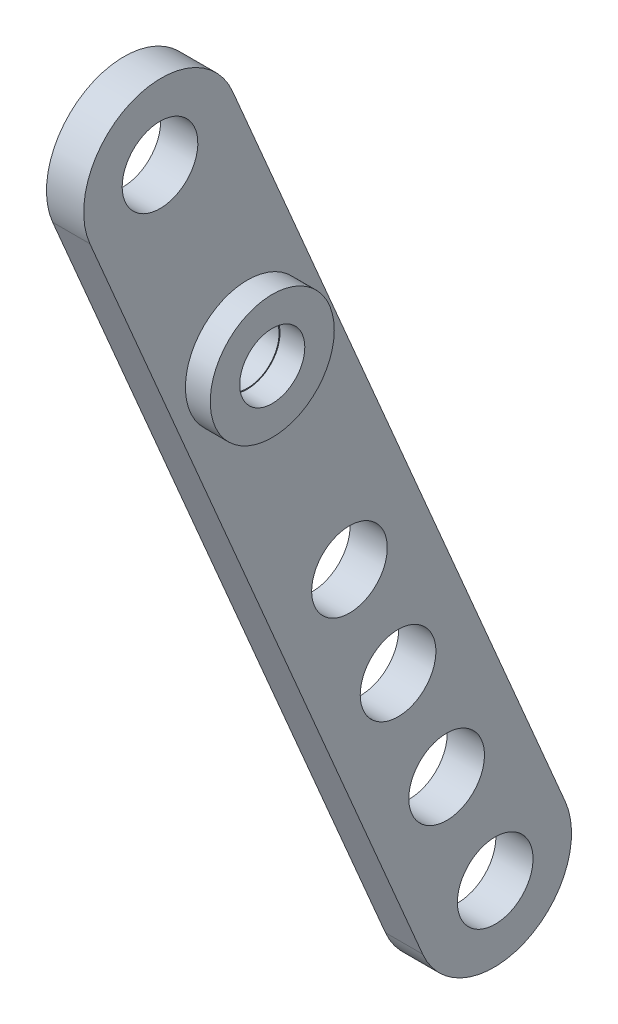
ISO-10303-21;
HEADER;
FILE_DESCRIPTION(('STEP AP214'),'2;1');
FILE_NAME('part.step','',(''),(''),'','','');
FILE_SCHEMA(('AUTOMOTIVE_DESIGN { 1 0 10303 214 1 1 1 1 }'));
ENDSEC;
DATA;
#1=APPLICATION_CONTEXT('core data for automotive mechanical design processes');
#2=APPLICATION_PROTOCOL_DEFINITION('international standard','automotive_design',2000,#1);
#3=PRODUCT_CONTEXT('',#1,'mechanical');
#4=PRODUCT('Part','Part','',(#3));
#5=PRODUCT_RELATED_PRODUCT_CATEGORY('part','',(#4));
#6=PRODUCT_DEFINITION_FORMATION('','',#4);
#7=PRODUCT_DEFINITION_CONTEXT('part definition',#1,'design');
#8=PRODUCT_DEFINITION('design','',#6,#7);
#9=PRODUCT_DEFINITION_SHAPE('','',#8);
#10=(LENGTH_UNIT() NAMED_UNIT(*) SI_UNIT(.MILLI.,.METRE.));
#11=(NAMED_UNIT(*) PLANE_ANGLE_UNIT() SI_UNIT($,.RADIAN.));
#12=(NAMED_UNIT(*) SI_UNIT($,.STERADIAN.) SOLID_ANGLE_UNIT());
#13=UNCERTAINTY_MEASURE_WITH_UNIT(LENGTH_MEASURE(1.E-05),#10,'distance_accuracy_value','');
#14=(GEOMETRIC_REPRESENTATION_CONTEXT(3) GLOBAL_UNCERTAINTY_ASSIGNED_CONTEXT((#13)) GLOBAL_UNIT_ASSIGNED_CONTEXT((#10,
#11,#12)) REPRESENTATION_CONTEXT('',''));
#15=CARTESIAN_POINT('',(0.,0.,0.));
#16=DIRECTION('',(0.,0.,1.));
#17=DIRECTION('',(1.,0.,0.));
#18=AXIS2_PLACEMENT_3D('',#15,#16,#17);
#19=CARTESIAN_POINT('',(12.5,25.9263817960788,-40.1354648199628));
#20=DIRECTION('',(-1.,0.,0.));
#21=DIRECTION('',(0.,1.,0.));
#22=AXIS2_PLACEMENT_3D('',#19,#20,#21);
#23=PLANE('',#22);
#24=CARTESIAN_POINT('',(12.5,25.9263817960788,-40.1354648199628));
#25=DIRECTION('',(1.,0.,0.));
#26=DIRECTION('',(0.,0.,1.));
#27=AXIS2_PLACEMENT_3D('',#24,#25,#26);
#28=CIRCLE('',#27,5.25);
#29=CARTESIAN_POINT('',(12.5,25.9263817960788,-34.8854648199628));
#30=VERTEX_POINT('',#29);
#31=EDGE_CURVE('E11',#30,#30,#28,.T.);
#32=ORIENTED_EDGE('',*,*,#31,.T.);
#33=EDGE_LOOP('',(#32));
#34=FACE_BOUND('',#33,.T.);
#35=CARTESIAN_POINT('',(12.5,25.9263817960788,-40.1354648199628));
#36=DIRECTION('',(-1.,0.,0.));
#37=DIRECTION('',(0.,0.,1.));
#38=AXIS2_PLACEMENT_3D('',#35,#36,#37);
#39=CIRCLE('',#38,10.);
#40=CARTESIAN_POINT('',(12.5,25.9263817960788,-30.1354648199628));
#41=VERTEX_POINT('',#40);
#42=EDGE_CURVE('E21',#41,#41,#39,.T.);
#43=ORIENTED_EDGE('',*,*,#42,.T.);
#44=EDGE_LOOP('',(#43));
#45=FACE_BOUND('',#44,.T.);
#46=ADVANCED_FACE('F17',(#34,#45),#23,.T.);
#47=CARTESIAN_POINT('',(14.5,25.9263817960788,-40.1354648199628));
#48=DIRECTION('',(-1.,0.,0.));
#49=DIRECTION('',(0.,0.,1.));
#50=AXIS2_PLACEMENT_3D('',#47,#48,#49);
#51=CYLINDRICAL_SURFACE('',#50,5.25);
#52=CARTESIAN_POINT('',(14.5,25.9263817960788,-40.1354648199628));
#53=DIRECTION('',(1.,0.,0.));
#54=DIRECTION('',(0.,0.,1.));
#55=AXIS2_PLACEMENT_3D('',#52,#53,#54);
#56=CIRCLE('',#55,5.25);
#57=CARTESIAN_POINT('',(14.5,25.9263817960788,-34.8854648199628));
#58=VERTEX_POINT('',#57);
#59=EDGE_CURVE('E241',#58,#58,#56,.T.);
#60=ORIENTED_EDGE('',*,*,#59,.T.);
#61=EDGE_LOOP('',(#60));
#62=FACE_BOUND('',#61,.T.);
#63=ORIENTED_EDGE('',*,*,#31,.F.);
#64=EDGE_LOOP('',(#63));
#65=FACE_BOUND('',#64,.T.);
#66=ADVANCED_FACE('F19',(#62,#65),#51,.F.);
#67=CARTESIAN_POINT('',(14.5,25.9263817960788,-40.1354648199628));
#68=DIRECTION('',(-1.,0.,0.));
#69=DIRECTION('',(0.,0.,1.));
#70=AXIS2_PLACEMENT_3D('',#67,#68,#69);
#71=CYLINDRICAL_SURFACE('',#70,10.);
#72=CARTESIAN_POINT('',(14.5,25.9263817960788,-40.1354648199628));
#73=DIRECTION('',(-1.,0.,0.));
#74=DIRECTION('',(0.,0.,1.));
#75=AXIS2_PLACEMENT_3D('',#72,#73,#74);
#76=CIRCLE('',#75,10.);
#77=CARTESIAN_POINT('',(14.5,25.9263817960788,-30.1354648199628));
#78=VERTEX_POINT('',#77);
#79=EDGE_CURVE('E239',#78,#78,#76,.T.);
#80=ORIENTED_EDGE('',*,*,#79,.T.);
#81=EDGE_LOOP('',(#80));
#82=FACE_BOUND('',#81,.T.);
#83=ORIENTED_EDGE('',*,*,#42,.F.);
#84=EDGE_LOOP('',(#83));
#85=FACE_BOUND('',#84,.T.);
#86=ADVANCED_FACE('F388',(#82,#85),#71,.T.);
#87=CARTESIAN_POINT('',(14.5,22.5201189785171,-0.434989200758586));
#88=DIRECTION('',(1.,0.,0.));
#89=DIRECTION('',(0.,0.,-1.));
#90=AXIS2_PLACEMENT_3D('',#87,#88,#89);
#91=PLANE('',#90);
#92=CARTESIAN_POINT('',(14.5,25.9263817960858,-40.1354648199622));
#93=DIRECTION('',(1.,0.,0.));
#94=DIRECTION('',(0.,-0.920081490833036,-0.391727009825028));
#95=AXIS2_PLACEMENT_3D('',#92,#93,#94);
#96=CIRCLE('',#95,5.1);
#97=CARTESIAN_POINT('',(14.5,21.2339661928374,-42.1332725700699));
#98=VERTEX_POINT('',#97);
#99=EDGE_CURVE('E236',#98,#98,#96,.T.);
#100=ORIENTED_EDGE('',*,*,#99,.T.);
#101=EDGE_LOOP('',(#100));
#102=FACE_BOUND('',#101,.T.);
#103=ORIENTED_EDGE('',*,*,#59,.F.);
#104=EDGE_LOOP('',(#103));
#105=FACE_BOUND('',#104,.T.);
#106=ADVANCED_FACE('F267',(#102,#105),#91,.F.);
#107=CARTESIAN_POINT('',(14.5,22.5201189785171,-0.434989200758586));
#108=DIRECTION('',(1.,0.,0.));
#109=DIRECTION('',(0.,0.,-1.));
#110=AXIS2_PLACEMENT_3D('',#107,#108,#109);
#111=PLANE('',#110);
#112=CARTESIAN_POINT('',(14.5,-12.7170408189017,-56.5879992326134));
#113=DIRECTION('',(1.,0.,0.));
#114=DIRECTION('',(0.,-0.920081490833036,-0.391727009825028));
#115=AXIS2_PLACEMENT_3D('',#112,#113,#114);
#116=CIRCLE('',#115,6.1);
#117=CARTESIAN_POINT('',(14.5,-18.3295379129832,-58.9775339925461));
#118=VERTEX_POINT('',#117);
#119=EDGE_CURVE('E233',#118,#118,#116,.T.);
#120=ORIENTED_EDGE('',*,*,#119,.T.);
#121=EDGE_LOOP('',(#120));
#122=FACE_BOUND('',#121,.T.);
#123=CARTESIAN_POINT('',(14.5,59.0493154660752,-26.0332924662612));
#124=DIRECTION('',(1.,0.,0.));
#125=DIRECTION('',(0.,-0.920081490833036,-0.391727009825028));
#126=AXIS2_PLACEMENT_3D('',#123,#124,#125);
#127=CIRCLE('',#126,6.1);
#128=CARTESIAN_POINT('',(14.5,53.4368183719936,-28.4228272261939));
#129=VERTEX_POINT('',#128);
#130=EDGE_CURVE('E189',#129,#129,#127,.T.);
#131=ORIENTED_EDGE('',*,*,#130,.T.);
#132=EDGE_LOOP('',(#131));
#133=FACE_BOUND('',#132,.T.);
#134=CARTESIAN_POINT('',(14.5,-67.9219302688839,-80.0916198221151));
#135=DIRECTION('',(1.,0.,0.));
#136=DIRECTION('',(0.,-0.920081490833036,-0.391727009825028));
#137=AXIS2_PLACEMENT_3D('',#134,#135,#136);
#138=CIRCLE('',#137,6.1);
#139=CARTESIAN_POINT('',(14.5,-73.5344273629654,-82.4811545820478));
#140=VERTEX_POINT('',#139);
#141=EDGE_CURVE('E186',#140,#140,#138,.T.);
#142=ORIENTED_EDGE('',*,*,#141,.T.);
#143=EDGE_LOOP('',(#142));
#144=FACE_BOUND('',#143,.T.);
#145=CARTESIAN_POINT('',(14.5,-31.1186706355624,-64.422539429114));
#146=DIRECTION('',(1.,0.,0.));
#147=DIRECTION('',(0.,-0.920081490833036,-0.391727009825028));
#148=AXIS2_PLACEMENT_3D('',#145,#146,#147);
#149=CIRCLE('',#148,6.1);
#150=CARTESIAN_POINT('',(14.5,-36.7311677296439,-66.8120741890466));
#151=VERTEX_POINT('',#150);
#152=EDGE_CURVE('E190',#151,#151,#149,.T.);
#153=ORIENTED_EDGE('',*,*,#152,.T.);
#154=EDGE_LOOP('',(#153));
#155=FACE_BOUND('',#154,.T.);
#156=CARTESIAN_POINT('',(14.5,-49.5203004522231,-72.2570796256145));
#157=DIRECTION('',(1.,0.,0.));
#158=DIRECTION('',(0.,-0.920081490833036,-0.391727009825028));
#159=AXIS2_PLACEMENT_3D('',#156,#157,#158);
#160=CIRCLE('',#159,6.1);
#161=CARTESIAN_POINT('',(14.5,-55.1327975463046,-74.6466143855472));
#162=VERTEX_POINT('',#161);
#163=EDGE_CURVE('E226',#162,#162,#160,.T.);
#164=ORIENTED_EDGE('',*,*,#163,.T.);
#165=EDGE_LOOP('',(#164));
#166=FACE_BOUND('',#165,.T.);
#167=ORIENTED_EDGE('',*,*,#79,.F.);
#168=EDGE_LOOP('',(#167));
#169=FACE_BOUND('',#168,.T.);
#170=CARTESIAN_POINT('',(14.5,-67.4618895234673,-79.8957563172026));
#171=DIRECTION('',(1.,0.,0.));
#172=DIRECTION('',(0.,-0.391727009825028,0.920081490833036));
#173=AXIS2_PLACEMENT_3D('',#170,#171,#172);
#174=CIRCLE('',#173,12.5);
#175=CARTESIAN_POINT('',(14.5,-72.3584771462802,-68.3947376817896));
#176=VERTEX_POINT('',#175);
#177=CARTESIAN_POINT('',(14.5,-62.5653019006545,-91.3967749526155));
#178=VERTEX_POINT('',#177);
#179=EDGE_CURVE('E222',#176,#178,#174,.T.);
#180=ORIENTED_EDGE('',*,*,#179,.F.);
#181=DIRECTION('',(0.,-0.920081490833036,-0.391727009825028));
#182=VECTOR('',#181,1.);
#183=CARTESIAN_POINT('',(14.5,53.6926870978458,-14.7281373357608));
#184=LINE('',#183,#182);
#185=CARTESIAN_POINT('',(14.5,53.6926870978458,-14.7281373357608));
#186=VERTEX_POINT('',#185);
#187=EDGE_CURVE('E216',#186,#176,#184,.T.);
#188=ORIENTED_EDGE('',*,*,#187,.F.);
#189=CARTESIAN_POINT('',(14.5,58.5892747206586,-26.2291559711737));
#190=DIRECTION('',(1.,0.,0.));
#191=DIRECTION('',(0.,0.391727009825028,-0.920081490833036));
#192=AXIS2_PLACEMENT_3D('',#189,#190,#191);
#193=CIRCLE('',#192,12.5);
#194=CARTESIAN_POINT('',(14.5,63.4858623434715,-37.7301746065867));
#195=VERTEX_POINT('',#194);
#196=EDGE_CURVE('E209',#195,#186,#193,.T.);
#197=ORIENTED_EDGE('',*,*,#196,.F.);
#198=DIRECTION('',(0.,0.920081490833036,0.391727009825028));
#199=VECTOR('',#198,1.);
#200=CARTESIAN_POINT('',(14.5,-62.5653019006545,-91.3967749526155));
#201=LINE('',#200,#199);
#202=EDGE_CURVE('E153',#178,#195,#201,.T.);
#203=ORIENTED_EDGE('',*,*,#202,.F.);
#204=EDGE_LOOP('',(#180,#188,#197,#203));
#205=FACE_BOUND('',#204,.T.);
#206=ADVANCED_FACE('F262',(#122,#133,#144,#155,#166,#169,#205),#111,.F.);
#207=CARTESIAN_POINT('',(14.5,25.9263817960858,-40.1354648199622));
#208=DIRECTION('',(1.,0.,0.));
#209=DIRECTION('',(0.,-0.920081490833036,-0.391727009825028));
#210=AXIS2_PLACEMENT_3D('',#207,#208,#209);
#211=CYLINDRICAL_SURFACE('',#210,5.1);
#212=CARTESIAN_POINT('',(20.5,25.9263817960858,-40.1354648199622));
#213=DIRECTION('',(-1.,0.,0.));
#214=DIRECTION('',(0.,-0.920081490833036,-0.391727009825028));
#215=AXIS2_PLACEMENT_3D('',#212,#213,#214);
#216=CIRCLE('',#215,5.1);
#217=CARTESIAN_POINT('',(20.5,21.2339661928374,-42.1332725700699));
#218=VERTEX_POINT('',#217);
#219=EDGE_CURVE('E148',#218,#218,#216,.T.);
#220=ORIENTED_EDGE('',*,*,#219,.F.);
#221=EDGE_LOOP('',(#220));
#222=FACE_BOUND('',#221,.T.);
#223=ORIENTED_EDGE('',*,*,#99,.F.);
#224=EDGE_LOOP('',(#223));
#225=FACE_BOUND('',#224,.T.);
#226=ADVANCED_FACE('F266',(#222,#225),#211,.F.);
#227=CARTESIAN_POINT('',(14.5,-12.7170408189017,-56.5879992326134));
#228=DIRECTION('',(1.,0.,0.));
#229=DIRECTION('',(0.,-0.920081490833036,-0.391727009825028));
#230=AXIS2_PLACEMENT_3D('',#227,#228,#229);
#231=CYLINDRICAL_SURFACE('',#230,6.1);
#232=CARTESIAN_POINT('',(20.5,-12.7170408189017,-56.5879992326134));
#233=DIRECTION('',(-1.,0.,0.));
#234=DIRECTION('',(0.,-0.920081490833036,-0.391727009825028));
#235=AXIS2_PLACEMENT_3D('',#232,#233,#234);
#236=CIRCLE('',#235,6.1);
#237=CARTESIAN_POINT('',(20.5,-18.3295379129832,-58.9775339925461));
#238=VERTEX_POINT('',#237);
#239=EDGE_CURVE('E154',#238,#238,#236,.T.);
#240=ORIENTED_EDGE('',*,*,#239,.F.);
#241=EDGE_LOOP('',(#240));
#242=FACE_BOUND('',#241,.T.);
#243=ORIENTED_EDGE('',*,*,#119,.F.);
#244=EDGE_LOOP('',(#243));
#245=FACE_BOUND('',#244,.T.);
#246=ADVANCED_FACE('F367',(#242,#245),#231,.F.);
#247=CARTESIAN_POINT('',(14.5,59.0493154660752,-26.0332924662612));
#248=DIRECTION('',(1.,0.,0.));
#249=DIRECTION('',(0.,-0.920081490833036,-0.391727009825028));
#250=AXIS2_PLACEMENT_3D('',#247,#248,#249);
#251=CYLINDRICAL_SURFACE('',#250,6.1);
#252=CARTESIAN_POINT('',(20.5,59.0493154660752,-26.0332924662612));
#253=DIRECTION('',(-1.,0.,0.));
#254=DIRECTION('',(0.,-0.920081490833036,-0.391727009825028));
#255=AXIS2_PLACEMENT_3D('',#252,#253,#254);
#256=CIRCLE('',#255,6.1);
#257=CARTESIAN_POINT('',(20.5,53.4368183719936,-28.4228272261939));
#258=VERTEX_POINT('',#257);
#259=EDGE_CURVE('E164',#258,#258,#256,.T.);
#260=ORIENTED_EDGE('',*,*,#259,.F.);
#261=EDGE_LOOP('',(#260));
#262=FACE_BOUND('',#261,.T.);
#263=ORIENTED_EDGE('',*,*,#130,.F.);
#264=EDGE_LOOP('',(#263));
#265=FACE_BOUND('',#264,.T.);
#266=ADVANCED_FACE('F277',(#262,#265),#251,.F.);
#267=CARTESIAN_POINT('',(14.5,-67.9219302688839,-80.0916198221151));
#268=DIRECTION('',(1.,0.,0.));
#269=DIRECTION('',(0.,-0.920081490833036,-0.391727009825028));
#270=AXIS2_PLACEMENT_3D('',#267,#268,#269);
#271=CYLINDRICAL_SURFACE('',#270,6.1);
#272=CARTESIAN_POINT('',(20.5,-67.9219302688839,-80.0916198221151));
#273=DIRECTION('',(-1.,0.,0.));
#274=DIRECTION('',(0.,-0.920081490833036,-0.391727009825028));
#275=AXIS2_PLACEMENT_3D('',#272,#273,#274);
#276=CIRCLE('',#275,6.1);
#277=CARTESIAN_POINT('',(20.5,-73.5344273629654,-82.4811545820478));
#278=VERTEX_POINT('',#277);
#279=EDGE_CURVE('E191',#278,#278,#276,.T.);
#280=ORIENTED_EDGE('',*,*,#279,.F.);
#281=EDGE_LOOP('',(#280));
#282=FACE_BOUND('',#281,.T.);
#283=ORIENTED_EDGE('',*,*,#141,.F.);
#284=EDGE_LOOP('',(#283));
#285=FACE_BOUND('',#284,.T.);
#286=ADVANCED_FACE('F272',(#282,#285),#271,.F.);
#287=CARTESIAN_POINT('',(14.5,-31.1186706355624,-64.422539429114));
#288=DIRECTION('',(1.,0.,0.));
#289=DIRECTION('',(0.,-0.920081490833036,-0.391727009825028));
#290=AXIS2_PLACEMENT_3D('',#287,#288,#289);
#291=CYLINDRICAL_SURFACE('',#290,6.1);
#292=CARTESIAN_POINT('',(20.5,-31.1186706355624,-64.422539429114));
#293=DIRECTION('',(-1.,0.,0.));
#294=DIRECTION('',(0.,-0.920081490833036,-0.391727009825028));
#295=AXIS2_PLACEMENT_3D('',#292,#293,#294);
#296=CIRCLE('',#295,6.1);
#297=CARTESIAN_POINT('',(20.5,-36.7311677296439,-66.8120741890466));
#298=VERTEX_POINT('',#297);
#299=EDGE_CURVE('E194',#298,#298,#296,.T.);
#300=ORIENTED_EDGE('',*,*,#299,.F.);
#301=EDGE_LOOP('',(#300));
#302=FACE_BOUND('',#301,.T.);
#303=ORIENTED_EDGE('',*,*,#152,.F.);
#304=EDGE_LOOP('',(#303));
#305=FACE_BOUND('',#304,.T.);
#306=ADVANCED_FACE('F276',(#302,#305),#291,.F.);
#307=CARTESIAN_POINT('',(14.5,-49.5203004522231,-72.2570796256145));
#308=DIRECTION('',(1.,0.,0.));
#309=DIRECTION('',(0.,-0.920081490833036,-0.391727009825028));
#310=AXIS2_PLACEMENT_3D('',#307,#308,#309);
#311=CYLINDRICAL_SURFACE('',#310,6.1);
#312=CARTESIAN_POINT('',(20.5,-49.5203004522231,-72.2570796256145));
#313=DIRECTION('',(-1.,0.,0.));
#314=DIRECTION('',(0.,-0.920081490833036,-0.391727009825028));
#315=AXIS2_PLACEMENT_3D('',#312,#313,#314);
#316=CIRCLE('',#315,6.1);
#317=CARTESIAN_POINT('',(20.5,-55.1327975463046,-74.6466143855472));
#318=VERTEX_POINT('',#317);
#319=EDGE_CURVE('E180',#318,#318,#316,.T.);
#320=ORIENTED_EDGE('',*,*,#319,.F.);
#321=EDGE_LOOP('',(#320));
#322=FACE_BOUND('',#321,.T.);
#323=ORIENTED_EDGE('',*,*,#163,.F.);
#324=EDGE_LOOP('',(#323));
#325=FACE_BOUND('',#324,.T.);
#326=ADVANCED_FACE('F337',(#322,#325),#311,.F.);
#327=CARTESIAN_POINT('',(14.5,-67.4618895234673,-79.8957563172026));
#328=DIRECTION('',(1.,0.,0.));
#329=DIRECTION('',(0.,-0.391727009825028,0.920081490833036));
#330=AXIS2_PLACEMENT_3D('',#327,#328,#329);
#331=CYLINDRICAL_SURFACE('',#330,12.5);
#332=ORIENTED_EDGE('',*,*,#179,.T.);
#333=DIRECTION('',(1.,0.,0.));
#334=VECTOR('',#333,1.);
#335=CARTESIAN_POINT('',(14.5,-62.5653019006545,-91.3967749526155));
#336=LINE('',#335,#334);
#337=CARTESIAN_POINT('',(20.5,-62.5653019006545,-91.3967749526155));
#338=VERTEX_POINT('',#337);
#339=EDGE_CURVE('E206',#178,#338,#336,.T.);
#340=ORIENTED_EDGE('',*,*,#339,.T.);
#341=CARTESIAN_POINT('',(20.5,-67.4618895234673,-79.8957563172026));
#342=DIRECTION('',(1.,0.,0.));
#343=DIRECTION('',(0.,-0.391727009825028,0.920081490833036));
#344=AXIS2_PLACEMENT_3D('',#341,#342,#343);
#345=CIRCLE('',#344,12.5);
#346=CARTESIAN_POINT('',(20.5,-72.3584771462802,-68.3947376817896));
#347=VERTEX_POINT('',#346);
#348=EDGE_CURVE('E176',#347,#338,#345,.T.);
#349=ORIENTED_EDGE('',*,*,#348,.F.);
#350=DIRECTION('',(1.,0.,0.));
#351=VECTOR('',#350,1.);
#352=CARTESIAN_POINT('',(14.5,-72.3584771462802,-68.3947376817896));
#353=LINE('',#352,#351);
#354=EDGE_CURVE('E220',#176,#347,#353,.T.);
#355=ORIENTED_EDGE('',*,*,#354,.F.);
#356=EDGE_LOOP('',(#332,#340,#349,#355));
#357=FACE_BOUND('',#356,.T.);
#358=ADVANCED_FACE('F345',(#357),#331,.T.);
#359=CARTESIAN_POINT('',(14.5,53.6926870978458,-14.7281373357608));
#360=DIRECTION('',(0.,-0.391727009825028,0.920081490833036));
#361=DIRECTION('',(-1.,0.,0.));
#362=AXIS2_PLACEMENT_3D('',#359,#360,#361);
#363=PLANE('',#362);
#364=ORIENTED_EDGE('',*,*,#187,.T.);
#365=ORIENTED_EDGE('',*,*,#354,.T.);
#366=DIRECTION('',(0.,-0.920081490833036,-0.391727009825028));
#367=VECTOR('',#366,1.);
#368=CARTESIAN_POINT('',(20.5,53.6926870978458,-14.7281373357608));
#369=LINE('',#368,#367);
#370=CARTESIAN_POINT('',(20.5,53.6926870978458,-14.7281373357608));
#371=VERTEX_POINT('',#370);
#372=EDGE_CURVE('E181',#371,#347,#369,.T.);
#373=ORIENTED_EDGE('',*,*,#372,.F.);
#374=DIRECTION('',(1.,0.,0.));
#375=VECTOR('',#374,1.);
#376=CARTESIAN_POINT('',(14.5,53.6926870978458,-14.7281373357608));
#377=LINE('',#376,#375);
#378=EDGE_CURVE('E213',#186,#371,#377,.T.);
#379=ORIENTED_EDGE('',*,*,#378,.F.);
#380=EDGE_LOOP('',(#364,#365,#373,#379));
#381=FACE_BOUND('',#380,.T.);
#382=ADVANCED_FACE('F329',(#381),#363,.T.);
#383=CARTESIAN_POINT('',(14.5,58.5892747206586,-26.2291559711737));
#384=DIRECTION('',(1.,0.,0.));
#385=DIRECTION('',(0.,0.391727009825028,-0.920081490833036));
#386=AXIS2_PLACEMENT_3D('',#383,#384,#385);
#387=CYLINDRICAL_SURFACE('',#386,12.5);
#388=ORIENTED_EDGE('',*,*,#196,.T.);
#389=ORIENTED_EDGE('',*,*,#378,.T.);
#390=CARTESIAN_POINT('',(20.5,58.5892747206586,-26.2291559711737));
#391=DIRECTION('',(1.,0.,0.));
#392=DIRECTION('',(0.,0.391727009825028,-0.920081490833036));
#393=AXIS2_PLACEMENT_3D('',#390,#391,#392);
#394=CIRCLE('',#393,12.5);
#395=CARTESIAN_POINT('',(20.5,63.4858623434715,-37.7301746065867));
#396=VERTEX_POINT('',#395);
#397=EDGE_CURVE('E185',#396,#371,#394,.T.);
#398=ORIENTED_EDGE('',*,*,#397,.F.);
#399=DIRECTION('',(1.,0.,0.));
#400=VECTOR('',#399,1.);
#401=CARTESIAN_POINT('',(14.5,63.4858623434715,-37.7301746065867));
#402=LINE('',#401,#400);
#403=EDGE_CURVE('E161',#195,#396,#402,.T.);
#404=ORIENTED_EDGE('',*,*,#403,.F.);
#405=EDGE_LOOP('',(#388,#389,#398,#404));
#406=FACE_BOUND('',#405,.T.);
#407=ADVANCED_FACE('F315',(#406),#387,.T.);
#408=CARTESIAN_POINT('',(14.5,-62.5653019006545,-91.3967749526155));
#409=DIRECTION('',(0.,0.391727009825028,-0.920081490833036));
#410=DIRECTION('',(-1.,0.,0.));
#411=AXIS2_PLACEMENT_3D('',#408,#409,#410);
#412=PLANE('',#411);
#413=ORIENTED_EDGE('',*,*,#202,.T.);
#414=ORIENTED_EDGE('',*,*,#403,.T.);
#415=DIRECTION('',(0.,0.920081490833036,0.391727009825028));
#416=VECTOR('',#415,1.);
#417=CARTESIAN_POINT('',(20.5,-62.5653019006545,-91.3967749526155));
#418=LINE('',#417,#416);
#419=EDGE_CURVE('E175',#338,#396,#418,.T.);
#420=ORIENTED_EDGE('',*,*,#419,.F.);
#421=ORIENTED_EDGE('',*,*,#339,.F.);
#422=EDGE_LOOP('',(#413,#414,#420,#421));
#423=FACE_BOUND('',#422,.T.);
#424=ADVANCED_FACE('F308',(#423),#412,.T.);
#425=CARTESIAN_POINT('',(20.5,22.5201189785171,-0.434989200758588));
#426=DIRECTION('',(1.,0.,0.));
#427=DIRECTION('',(0.,0.,-1.));
#428=AXIS2_PLACEMENT_3D('',#425,#426,#427);
#429=PLANE('',#428);
#430=ORIENTED_EDGE('',*,*,#219,.T.);
#431=EDGE_LOOP('',(#430));
#432=FACE_BOUND('',#431,.T.);
#433=CARTESIAN_POINT('',(20.5,25.9263817960788,-40.1354648199628));
#434=DIRECTION('',(-1.,0.,0.));
#435=DIRECTION('',(0.,0.,-1.));
#436=AXIS2_PLACEMENT_3D('',#433,#434,#435);
#437=CIRCLE('',#436,5.25);
#438=CARTESIAN_POINT('',(20.5,25.9263817960788,-45.3854648199628));
#439=VERTEX_POINT('',#438);
#440=EDGE_CURVE('E170',#439,#439,#437,.T.);
#441=ORIENTED_EDGE('',*,*,#440,.F.);
#442=EDGE_LOOP('',(#441));
#443=FACE_BOUND('',#442,.T.);
#444=ADVANCED_FACE('F149',(#432,#443),#429,.T.);
#445=CARTESIAN_POINT('',(24.5,25.9263817960858,-40.1354648199622));
#446=DIRECTION('',(1.,0.,0.));
#447=DIRECTION('',(0.,0.,-1.));
#448=AXIS2_PLACEMENT_3D('',#445,#446,#447);
#449=PLANE('',#448);
#450=CARTESIAN_POINT('',(24.5,25.9263817960858,-40.1354648199622));
#451=DIRECTION('',(-1.,0.,0.));
#452=DIRECTION('',(0.,0.,-1.));
#453=AXIS2_PLACEMENT_3D('',#450,#451,#452);
#454=CIRCLE('',#453,5.25);
#455=CARTESIAN_POINT('',(24.5,25.9263817960858,-45.3854648199622));
#456=VERTEX_POINT('',#455);
#457=EDGE_CURVE('E172',#456,#456,#454,.T.);
#458=ORIENTED_EDGE('',*,*,#457,.T.);
#459=EDGE_LOOP('',(#458));
#460=FACE_BOUND('',#459,.T.);
#461=CARTESIAN_POINT('',(24.5,25.9263817960858,-40.1354648199622));
#462=DIRECTION('',(1.,0.,0.));
#463=DIRECTION('',(0.,0.,-1.));
#464=AXIS2_PLACEMENT_3D('',#461,#462,#463);
#465=CIRCLE('',#464,10.);
#466=CARTESIAN_POINT('',(24.5,25.9263817960858,-50.1354648199622));
#467=VERTEX_POINT('',#466);
#468=EDGE_CURVE('E168',#467,#467,#465,.T.);
#469=ORIENTED_EDGE('',*,*,#468,.T.);
#470=EDGE_LOOP('',(#469));
#471=FACE_BOUND('',#470,.T.);
#472=ADVANCED_FACE('F293',(#460,#471),#449,.T.);
#473=CARTESIAN_POINT('',(20.5,22.5201189785171,-0.434989200758588));
#474=DIRECTION('',(1.,0.,0.));
#475=DIRECTION('',(0.,0.,-1.));
#476=AXIS2_PLACEMENT_3D('',#473,#474,#475);
#477=PLANE('',#476);
#478=ORIENTED_EDGE('',*,*,#239,.T.);
#479=EDGE_LOOP('',(#478));
#480=FACE_BOUND('',#479,.T.);
#481=ORIENTED_EDGE('',*,*,#259,.T.);
#482=EDGE_LOOP('',(#481));
#483=FACE_BOUND('',#482,.T.);
#484=ORIENTED_EDGE('',*,*,#279,.T.);
#485=EDGE_LOOP('',(#484));
#486=FACE_BOUND('',#485,.T.);
#487=ORIENTED_EDGE('',*,*,#299,.T.);
#488=EDGE_LOOP('',(#487));
#489=FACE_BOUND('',#488,.T.);
#490=ORIENTED_EDGE('',*,*,#319,.T.);
#491=EDGE_LOOP('',(#490));
#492=FACE_BOUND('',#491,.T.);
#493=CARTESIAN_POINT('',(20.5,25.9263817960788,-40.1354648199628));
#494=DIRECTION('',(1.,0.,0.));
#495=DIRECTION('',(0.,0.,-1.));
#496=AXIS2_PLACEMENT_3D('',#493,#494,#495);
#497=CIRCLE('',#496,10.);
#498=CARTESIAN_POINT('',(20.5,25.9263817960788,-50.1354648199628));
#499=VERTEX_POINT('',#498);
#500=EDGE_CURVE('E466',#499,#499,#497,.T.);
#501=ORIENTED_EDGE('',*,*,#500,.F.);
#502=EDGE_LOOP('',(#501));
#503=FACE_BOUND('',#502,.T.);
#504=ORIENTED_EDGE('',*,*,#419,.T.);
#505=ORIENTED_EDGE('',*,*,#397,.T.);
#506=ORIENTED_EDGE('',*,*,#372,.T.);
#507=ORIENTED_EDGE('',*,*,#348,.T.);
#508=EDGE_LOOP('',(#504,#505,#506,#507));
#509=FACE_BOUND('',#508,.T.);
#510=ADVANCED_FACE('F285',(#480,#483,#486,#489,#492,#503,#509),#477,.T.);
#511=CARTESIAN_POINT('',(20.5,25.9263817960788,-40.1354648199628));
#512=DIRECTION('',(1.,0.,0.));
#513=DIRECTION('',(0.,0.,-1.));
#514=AXIS2_PLACEMENT_3D('',#511,#512,#513);
#515=CYLINDRICAL_SURFACE('',#514,5.25);
#516=ORIENTED_EDGE('',*,*,#457,.F.);
#517=EDGE_LOOP('',(#516));
#518=FACE_BOUND('',#517,.T.);
#519=ORIENTED_EDGE('',*,*,#440,.T.);
#520=EDGE_LOOP('',(#519));
#521=FACE_BOUND('',#520,.T.);
#522=ADVANCED_FACE('F256',(#518,#521),#515,.F.);
#523=CARTESIAN_POINT('',(20.5,25.9263817960788,-40.1354648199628));
#524=DIRECTION('',(1.,0.,0.));
#525=DIRECTION('',(0.,0.,-1.));
#526=AXIS2_PLACEMENT_3D('',#523,#524,#525);
#527=CYLINDRICAL_SURFACE('',#526,10.);
#528=ORIENTED_EDGE('',*,*,#468,.F.);
#529=EDGE_LOOP('',(#528));
#530=FACE_BOUND('',#529,.T.);
#531=ORIENTED_EDGE('',*,*,#500,.T.);
#532=EDGE_LOOP('',(#531));
#533=FACE_BOUND('',#532,.T.);
#534=ADVANCED_FACE('F251',(#530,#533),#527,.T.);
#535=CLOSED_SHELL('',(#46,#66,#86,#106,#206,#226,#246,#266,#286,#306,#326,#358,#382,#407,#424,
#444,#472,#510,#522,#534));
#536=MANIFOLD_SOLID_BREP('B1',#535);
#537=ADVANCED_BREP_SHAPE_REPRESENTATION('',(#18,#536),#14);
#538=SHAPE_DEFINITION_REPRESENTATION(#9,#537);
ENDSEC;
END-ISO-10303-21;
